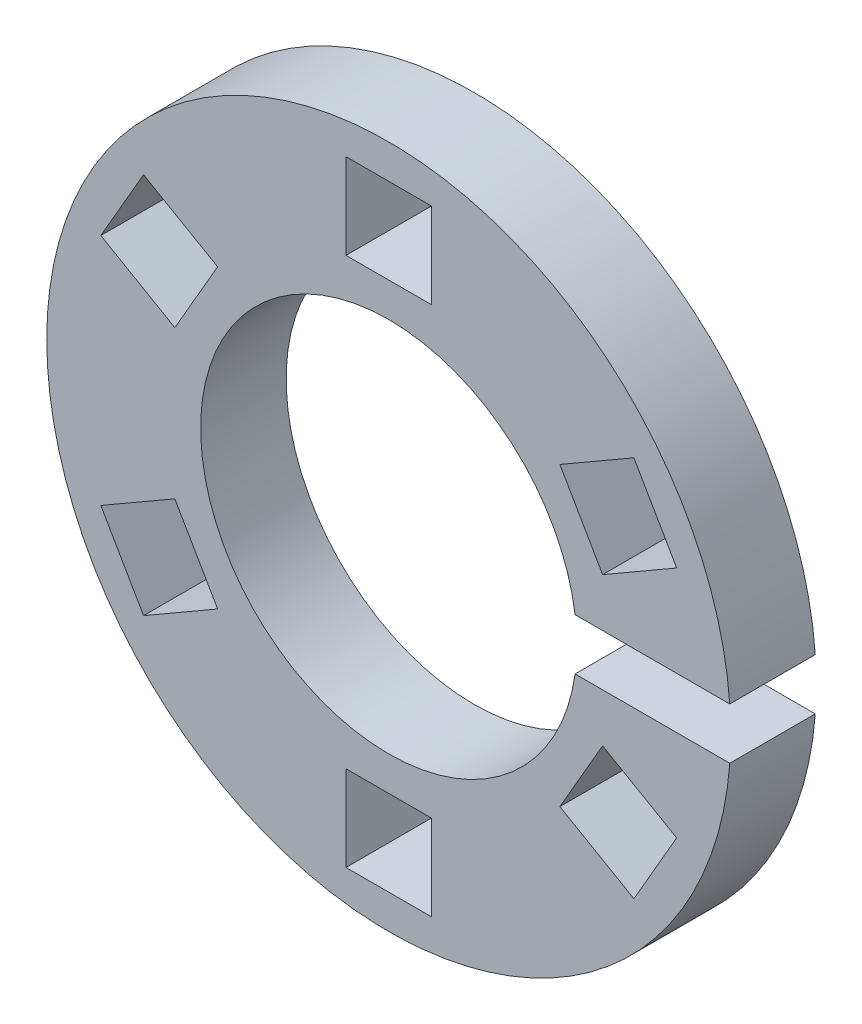
ISO-10303-21;
HEADER;
FILE_DESCRIPTION(('STEP AP214'),'2;1');
FILE_NAME('part.step','',(''),(''),'','','');
FILE_SCHEMA(('AUTOMOTIVE_DESIGN { 1 0 10303 214 1 1 1 1 }'));
ENDSEC;
DATA;
#1=APPLICATION_CONTEXT('core data for automotive mechanical design processes');
#2=APPLICATION_PROTOCOL_DEFINITION('international standard','automotive_design',2000,#1);
#3=PRODUCT_CONTEXT('',#1,'mechanical');
#4=PRODUCT('Part','Part','',(#3));
#5=PRODUCT_RELATED_PRODUCT_CATEGORY('part','',(#4));
#6=PRODUCT_DEFINITION_FORMATION('','',#4);
#7=PRODUCT_DEFINITION_CONTEXT('part definition',#1,'design');
#8=PRODUCT_DEFINITION('design','',#6,#7);
#9=PRODUCT_DEFINITION_SHAPE('','',#8);
#10=(LENGTH_UNIT() NAMED_UNIT(*) SI_UNIT(.MILLI.,.METRE.));
#11=(NAMED_UNIT(*) PLANE_ANGLE_UNIT() SI_UNIT($,.RADIAN.));
#12=(NAMED_UNIT(*) SI_UNIT($,.STERADIAN.) SOLID_ANGLE_UNIT());
#13=UNCERTAINTY_MEASURE_WITH_UNIT(LENGTH_MEASURE(1.E-05),#10,'distance_accuracy_value','');
#14=(GEOMETRIC_REPRESENTATION_CONTEXT(3) GLOBAL_UNCERTAINTY_ASSIGNED_CONTEXT((#13)) GLOBAL_UNIT_ASSIGNED_CONTEXT((#10,
#11,#12)) REPRESENTATION_CONTEXT('',''));
#15=CARTESIAN_POINT('',(0.,0.,0.));
#16=DIRECTION('',(0.,0.,1.));
#17=DIRECTION('',(1.,0.,0.));
#18=AXIS2_PLACEMENT_3D('',#15,#16,#17);
#19=CARTESIAN_POINT('',(-27.6044989172834,-2.55098574240287,21.2996199166411));
#20=DIRECTION('',(0.,0.,1.));
#21=DIRECTION('',(1.,0.,0.));
#22=AXIS2_PLACEMENT_3D('',#19,#20,#21);
#23=PLANE('',#22);
#24=DIRECTION('',(-1.,0.,0.));
#25=VECTOR('',#24,1.);
#26=CARTESIAN_POINT('',(-16.7072515584317,-1.05098574240287,21.2996199166411));
#27=LINE('',#26,#25);
#28=CARTESIAN_POINT('',(-7.66082824210429,-1.05098574240287,21.2996199166411));
#29=VERTEX_POINT('',#28);
#30=CARTESIAN_POINT('',(-16.7072515584317,-1.05098574240287,21.2996199166411));
#31=VERTEX_POINT('',#30);
#32=EDGE_CURVE('E237',#29,#31,#27,.T.);
#33=ORIENTED_EDGE('',*,*,#32,.F.);
#34=CARTESIAN_POINT('',(-27.6044989172834,-2.55098574240287,21.2996199166411));
#35=DIRECTION('',(0.,0.,1.));
#36=DIRECTION('',(1.,0.,0.));
#37=AXIS2_PLACEMENT_3D('',#34,#35,#36);
#38=CIRCLE('',#37,20.);
#39=CARTESIAN_POINT('',(-7.66082824210429,-4.05098574240287,21.2996199166411));
#40=VERTEX_POINT('',#39);
#41=EDGE_CURVE('E11',#29,#40,#38,.T.);
#42=ORIENTED_EDGE('',*,*,#41,.T.);
#43=DIRECTION('',(1.,0.,0.));
#44=VECTOR('',#43,1.);
#45=CARTESIAN_POINT('',(-16.7072515584317,-4.05098574240287,21.2996199166411));
#46=LINE('',#45,#44);
#47=CARTESIAN_POINT('',(-16.7072515584317,-4.05098574240287,21.2996199166411));
#48=VERTEX_POINT('',#47);
#49=EDGE_CURVE('E47',#48,#40,#46,.T.);
#50=ORIENTED_EDGE('',*,*,#49,.F.);
#51=CARTESIAN_POINT('',(-27.6044989172834,-2.55098574240287,21.2996199166411));
#52=DIRECTION('',(0.,0.,1.));
#53=DIRECTION('',(1.,0.,0.));
#54=AXIS2_PLACEMENT_3D('',#51,#52,#53);
#55=CIRCLE('',#54,11.);
#56=EDGE_CURVE('E224',#31,#48,#55,.T.);
#57=ORIENTED_EDGE('',*,*,#56,.F.);
#58=EDGE_LOOP('',(#33,#42,#50,#57));
#59=FACE_BOUND('',#58,.T.);
#60=DIRECTION('',(1.,0.,0.));
#61=VECTOR('',#60,1.);
#62=CARTESIAN_POINT('',(-30.1044989172834,10.4490142575971,21.2996199166411));
#63=LINE('',#62,#61);
#64=CARTESIAN_POINT('',(-30.1044989172834,10.4490142575971,21.2996199166411));
#65=VERTEX_POINT('',#64);
#66=CARTESIAN_POINT('',(-25.1044989172834,10.4490142575971,21.2996199166411));
#67=VERTEX_POINT('',#66);
#68=EDGE_CURVE('E406',#65,#67,#63,.T.);
#69=ORIENTED_EDGE('',*,*,#68,.F.);
#70=DIRECTION('',(0.,-1.,0.));
#71=VECTOR('',#70,1.);
#72=CARTESIAN_POINT('',(-30.1044989172834,15.4490142575971,21.2996199166411));
#73=LINE('',#72,#71);
#74=CARTESIAN_POINT('',(-30.1044989172834,15.4490142575971,21.2996199166411));
#75=VERTEX_POINT('',#74);
#76=EDGE_CURVE('E404',#75,#65,#73,.T.);
#77=ORIENTED_EDGE('',*,*,#76,.F.);
#78=DIRECTION('',(-1.,0.,0.));
#79=VECTOR('',#78,1.);
#80=CARTESIAN_POINT('',(-30.1044989172834,15.4490142575971,21.2996199166411));
#81=LINE('',#80,#79);
#82=CARTESIAN_POINT('',(-25.1044989172834,15.4490142575971,21.2996199166411));
#83=VERTEX_POINT('',#82);
#84=EDGE_CURVE('E412',#83,#75,#81,.T.);
#85=ORIENTED_EDGE('',*,*,#84,.F.);
#86=DIRECTION('',(0.,1.,0.));
#87=VECTOR('',#86,1.);
#88=CARTESIAN_POINT('',(-25.1044989172834,15.4490142575971,21.2996199166411));
#89=LINE('',#88,#87);
#90=EDGE_CURVE('E409',#67,#83,#89,.T.);
#91=ORIENTED_EDGE('',*,*,#90,.F.);
#92=EDGE_LOOP('',(#69,#77,#85,#91));
#93=FACE_BOUND('',#92,.T.);
#94=DIRECTION('',(-0.866025403784439,-0.5,0.));
#95=VECTOR('',#94,1.);
#96=CARTESIAN_POINT('',(-13.2660416491635,8.61407776705823,21.2996199166411));
#97=LINE('',#96,#95);
#98=CARTESIAN_POINT('',(-13.2660416491635,8.61407776705823,21.2996199166411));
#99=VERTEX_POINT('',#98);
#100=CARTESIAN_POINT('',(-17.5961686680857,6.11407776705823,21.2996199166411));
#101=VERTEX_POINT('',#100);
#102=EDGE_CURVE('E375',#99,#101,#97,.T.);
#103=ORIENTED_EDGE('',*,*,#102,.F.);
#104=DIRECTION('',(-0.5,0.866025403784438,0.));
#105=VECTOR('',#104,1.);
#106=CARTESIAN_POINT('',(-13.2660416491635,8.61407776705823,21.2996199166411));
#107=LINE('',#106,#105);
#108=CARTESIAN_POINT('',(-10.7660416491635,4.28395074813604,21.2996199166411));
#109=VERTEX_POINT('',#108);
#110=EDGE_CURVE('E373',#109,#99,#107,.T.);
#111=ORIENTED_EDGE('',*,*,#110,.F.);
#112=DIRECTION('',(0.866025403784438,0.500000000000001,0.));
#113=VECTOR('',#112,1.);
#114=CARTESIAN_POINT('',(-10.7660416491635,4.28395074813604,21.2996199166411));
#115=LINE('',#114,#113);
#116=CARTESIAN_POINT('',(-15.0961686680857,1.78395074813603,21.2996199166411));
#117=VERTEX_POINT('',#116);
#118=EDGE_CURVE('E381',#117,#109,#115,.T.);
#119=ORIENTED_EDGE('',*,*,#118,.F.);
#120=DIRECTION('',(0.5,-0.866025403784438,0.));
#121=VECTOR('',#120,1.);
#122=CARTESIAN_POINT('',(-17.5961686680857,6.11407776705823,21.2996199166411));
#123=LINE('',#122,#121);
#124=EDGE_CURVE('E378',#101,#117,#123,.T.);
#125=ORIENTED_EDGE('',*,*,#124,.F.);
#126=EDGE_LOOP('',(#103,#111,#119,#125));
#127=FACE_BOUND('',#126,.T.);
#128=DIRECTION('',(-0.866025403784439,0.5,0.));
#129=VECTOR('',#128,1.);
#130=CARTESIAN_POINT('',(-10.7660416491635,-9.38592223294176,21.2996199166411));
#131=LINE('',#130,#129);
#132=CARTESIAN_POINT('',(-10.7660416491635,-9.38592223294176,21.2996199166411));
#133=VERTEX_POINT('',#132);
#134=CARTESIAN_POINT('',(-15.0961686680857,-6.88592223294177,21.2996199166411));
#135=VERTEX_POINT('',#134);
#136=EDGE_CURVE('E344',#133,#135,#131,.T.);
#137=ORIENTED_EDGE('',*,*,#136,.F.);
#138=DIRECTION('',(0.5,0.866025403784439,0.));
#139=VECTOR('',#138,1.);
#140=CARTESIAN_POINT('',(-10.7660416491635,-9.38592223294176,21.2996199166411));
#141=LINE('',#140,#139);
#142=CARTESIAN_POINT('',(-13.2660416491635,-13.716049251864,21.2996199166411));
#143=VERTEX_POINT('',#142);
#144=EDGE_CURVE('E342',#143,#133,#141,.T.);
#145=ORIENTED_EDGE('',*,*,#144,.F.);
#146=DIRECTION('',(0.866025403784439,-0.499999999999999,0.));
#147=VECTOR('',#146,1.);
#148=CARTESIAN_POINT('',(-13.2660416491635,-13.716049251864,21.2996199166411));
#149=LINE('',#148,#147);
#150=CARTESIAN_POINT('',(-17.5961686680857,-11.216049251864,21.2996199166411));
#151=VERTEX_POINT('',#150);
#152=EDGE_CURVE('E350',#151,#143,#149,.T.);
#153=ORIENTED_EDGE('',*,*,#152,.F.);
#154=DIRECTION('',(-0.5,-0.866025403784439,0.));
#155=VECTOR('',#154,1.);
#156=CARTESIAN_POINT('',(-15.0961686680857,-6.88592223294177,21.2996199166411));
#157=LINE('',#156,#155);
#158=EDGE_CURVE('E347',#135,#151,#157,.T.);
#159=ORIENTED_EDGE('',*,*,#158,.F.);
#160=EDGE_LOOP('',(#137,#145,#153,#159));
#161=FACE_BOUND('',#160,.T.);
#162=DIRECTION('',(0.,1.,0.));
#163=VECTOR('',#162,1.);
#164=CARTESIAN_POINT('',(-25.1044989172834,-20.5509857424029,21.2996199166411));
#165=LINE('',#164,#163);
#166=CARTESIAN_POINT('',(-25.1044989172834,-20.5509857424029,21.2996199166411));
#167=VERTEX_POINT('',#166);
#168=CARTESIAN_POINT('',(-25.1044989172834,-15.5509857424029,21.2996199166411));
#169=VERTEX_POINT('',#168);
#170=EDGE_CURVE('E313',#167,#169,#165,.T.);
#171=ORIENTED_EDGE('',*,*,#170,.F.);
#172=DIRECTION('',(1.,0.,0.));
#173=VECTOR('',#172,1.);
#174=CARTESIAN_POINT('',(-25.1044989172834,-20.5509857424029,21.2996199166411));
#175=LINE('',#174,#173);
#176=CARTESIAN_POINT('',(-30.1044989172834,-20.5509857424029,21.2996199166411));
#177=VERTEX_POINT('',#176);
#178=EDGE_CURVE('E311',#177,#167,#175,.T.);
#179=ORIENTED_EDGE('',*,*,#178,.F.);
#180=DIRECTION('',(0.,-1.,0.));
#181=VECTOR('',#180,1.);
#182=CARTESIAN_POINT('',(-30.1044989172834,-20.5509857424029,21.2996199166411));
#183=LINE('',#182,#181);
#184=CARTESIAN_POINT('',(-30.1044989172834,-15.5509857424029,21.2996199166411));
#185=VERTEX_POINT('',#184);
#186=EDGE_CURVE('E319',#185,#177,#183,.T.);
#187=ORIENTED_EDGE('',*,*,#186,.F.);
#188=DIRECTION('',(-1.,0.,0.));
#189=VECTOR('',#188,1.);
#190=CARTESIAN_POINT('',(-25.1044989172834,-15.5509857424029,21.2996199166411));
#191=LINE('',#190,#189);
#192=EDGE_CURVE('E316',#169,#185,#191,.T.);
#193=ORIENTED_EDGE('',*,*,#192,.F.);
#194=EDGE_LOOP('',(#171,#179,#187,#193));
#195=FACE_BOUND('',#194,.T.);
#196=DIRECTION('',(0.866025403784438,0.5,0.));
#197=VECTOR('',#196,1.);
#198=CARTESIAN_POINT('',(-41.9429561854033,-13.716049251864,21.2996199166411));
#199=LINE('',#198,#197);
#200=CARTESIAN_POINT('',(-41.9429561854033,-13.716049251864,21.2996199166411));
#201=VERTEX_POINT('',#200);
#202=CARTESIAN_POINT('',(-37.6128291664811,-11.216049251864,21.2996199166411));
#203=VERTEX_POINT('',#202);
#204=EDGE_CURVE('E282',#201,#203,#199,.T.);
#205=ORIENTED_EDGE('',*,*,#204,.F.);
#206=DIRECTION('',(0.5,-0.866025403784438,0.));
#207=VECTOR('',#206,1.);
#208=CARTESIAN_POINT('',(-41.9429561854033,-13.716049251864,21.2996199166411));
#209=LINE('',#208,#207);
#210=CARTESIAN_POINT('',(-44.4429561854033,-9.38592223294178,21.2996199166411));
#211=VERTEX_POINT('',#210);
#212=EDGE_CURVE('E280',#211,#201,#209,.T.);
#213=ORIENTED_EDGE('',*,*,#212,.F.);
#214=DIRECTION('',(-0.866025403784438,-0.500000000000001,0.));
#215=VECTOR('',#214,1.);
#216=CARTESIAN_POINT('',(-44.4429561854033,-9.38592223294178,21.2996199166411));
#217=LINE('',#216,#215);
#218=CARTESIAN_POINT('',(-40.1128291664811,-6.88592223294177,21.2996199166411));
#219=VERTEX_POINT('',#218);
#220=EDGE_CURVE('E288',#219,#211,#217,.T.);
#221=ORIENTED_EDGE('',*,*,#220,.F.);
#222=DIRECTION('',(-0.5,0.866025403784438,0.));
#223=VECTOR('',#222,1.);
#224=CARTESIAN_POINT('',(-37.6128291664811,-11.216049251864,21.2996199166411));
#225=LINE('',#224,#223);
#226=EDGE_CURVE('E285',#203,#219,#225,.T.);
#227=ORIENTED_EDGE('',*,*,#226,.F.);
#228=EDGE_LOOP('',(#205,#213,#221,#227));
#229=FACE_BOUND('',#228,.T.);
#230=DIRECTION('',(0.866025403784439,-0.499999999999999,0.));
#231=VECTOR('',#230,1.);
#232=CARTESIAN_POINT('',(-44.4429561854033,4.28395074813602,21.2996199166411));
#233=LINE('',#232,#231);
#234=CARTESIAN_POINT('',(-44.4429561854033,4.28395074813602,21.2996199166411));
#235=VERTEX_POINT('',#234);
#236=CARTESIAN_POINT('',(-40.1128291664811,1.78395074813602,21.2996199166411));
#237=VERTEX_POINT('',#236);
#238=EDGE_CURVE('E253',#235,#237,#233,.T.);
#239=ORIENTED_EDGE('',*,*,#238,.F.);
#240=DIRECTION('',(-0.499999999999999,-0.866025403784439,0.));
#241=VECTOR('',#240,1.);
#242=CARTESIAN_POINT('',(-44.4429561854033,4.28395074813602,21.2996199166411));
#243=LINE('',#242,#241);
#244=CARTESIAN_POINT('',(-41.9429561854033,8.61407776705822,21.2996199166411));
#245=VERTEX_POINT('',#244);
#246=EDGE_CURVE('E251',#245,#235,#243,.T.);
#247=ORIENTED_EDGE('',*,*,#246,.F.);
#248=DIRECTION('',(-0.86602540378444,0.499999999999999,0.));
#249=VECTOR('',#248,1.);
#250=CARTESIAN_POINT('',(-41.9429561854033,8.61407776705822,21.2996199166411));
#251=LINE('',#250,#249);
#252=CARTESIAN_POINT('',(-37.6128291664811,6.11407776705822,21.2996199166411));
#253=VERTEX_POINT('',#252);
#254=EDGE_CURVE('E258',#253,#245,#251,.T.);
#255=ORIENTED_EDGE('',*,*,#254,.F.);
#256=DIRECTION('',(0.499999999999999,0.866025403784439,0.));
#257=VECTOR('',#256,1.);
#258=CARTESIAN_POINT('',(-40.1128291664811,1.78395074813602,21.2996199166411));
#259=LINE('',#258,#257);
#260=EDGE_CURVE('E256',#237,#253,#259,.T.);
#261=ORIENTED_EDGE('',*,*,#260,.F.);
#262=EDGE_LOOP('',(#239,#247,#255,#261));
#263=FACE_BOUND('',#262,.T.);
#264=ADVANCED_FACE('F32',(#59,#93,#127,#161,#195,#229,#263),#23,.T.);
#265=CARTESIAN_POINT('',(-27.6044989172834,-2.55098574240287,16.2996199166411));
#266=DIRECTION('',(0.,0.,1.));
#267=DIRECTION('',(1.,0.,0.));
#268=AXIS2_PLACEMENT_3D('',#265,#266,#267);
#269=PLANE('',#268);
#270=DIRECTION('',(0.5,-0.866025403784438,0.));
#271=VECTOR('',#270,1.);
#272=CARTESIAN_POINT('',(-41.9429561854033,-13.716049251864,16.2996199166411));
#273=LINE('',#272,#271);
#274=CARTESIAN_POINT('',(-44.4429561854033,-9.38592223294178,16.2996199166411));
#275=VERTEX_POINT('',#274);
#276=CARTESIAN_POINT('',(-41.9429561854033,-13.716049251864,16.2996199166411));
#277=VERTEX_POINT('',#276);
#278=EDGE_CURVE('E279',#275,#277,#273,.T.);
#279=ORIENTED_EDGE('',*,*,#278,.T.);
#280=DIRECTION('',(0.866025403784438,0.5,0.));
#281=VECTOR('',#280,1.);
#282=CARTESIAN_POINT('',(-41.9429561854033,-13.716049251864,16.2996199166411));
#283=LINE('',#282,#281);
#284=CARTESIAN_POINT('',(-37.6128291664811,-11.216049251864,16.2996199166411));
#285=VERTEX_POINT('',#284);
#286=EDGE_CURVE('E293',#277,#285,#283,.T.);
#287=ORIENTED_EDGE('',*,*,#286,.T.);
#288=DIRECTION('',(-0.5,0.866025403784438,0.));
#289=VECTOR('',#288,1.);
#290=CARTESIAN_POINT('',(-37.6128291664811,-11.216049251864,16.2996199166411));
#291=LINE('',#290,#289);
#292=CARTESIAN_POINT('',(-40.1128291664811,-6.88592223294177,16.2996199166411));
#293=VERTEX_POINT('',#292);
#294=EDGE_CURVE('E296',#285,#293,#291,.T.);
#295=ORIENTED_EDGE('',*,*,#294,.T.);
#296=DIRECTION('',(-0.866025403784438,-0.500000000000001,0.));
#297=VECTOR('',#296,1.);
#298=CARTESIAN_POINT('',(-44.4429561854033,-9.38592223294178,16.2996199166411));
#299=LINE('',#298,#297);
#300=EDGE_CURVE('E283',#293,#275,#299,.T.);
#301=ORIENTED_EDGE('',*,*,#300,.T.);
#302=EDGE_LOOP('',(#279,#287,#295,#301));
#303=FACE_BOUND('',#302,.T.);
#304=DIRECTION('',(0.5,0.866025403784439,0.));
#305=VECTOR('',#304,1.);
#306=CARTESIAN_POINT('',(-10.7660416491635,-9.38592223294176,16.2996199166411));
#307=LINE('',#306,#305);
#308=CARTESIAN_POINT('',(-13.2660416491635,-13.716049251864,16.2996199166411));
#309=VERTEX_POINT('',#308);
#310=CARTESIAN_POINT('',(-10.7660416491635,-9.38592223294176,16.2996199166411));
#311=VERTEX_POINT('',#310);
#312=EDGE_CURVE('E341',#309,#311,#307,.T.);
#313=ORIENTED_EDGE('',*,*,#312,.T.);
#314=DIRECTION('',(-0.866025403784439,0.5,0.));
#315=VECTOR('',#314,1.);
#316=CARTESIAN_POINT('',(-10.7660416491635,-9.38592223294176,16.2996199166411));
#317=LINE('',#316,#315);
#318=CARTESIAN_POINT('',(-15.0961686680857,-6.88592223294177,16.2996199166411));
#319=VERTEX_POINT('',#318);
#320=EDGE_CURVE('E355',#311,#319,#317,.T.);
#321=ORIENTED_EDGE('',*,*,#320,.T.);
#322=DIRECTION('',(-0.5,-0.866025403784439,0.));
#323=VECTOR('',#322,1.);
#324=CARTESIAN_POINT('',(-15.0961686680857,-6.88592223294177,16.2996199166411));
#325=LINE('',#324,#323);
#326=CARTESIAN_POINT('',(-17.5961686680857,-11.216049251864,16.2996199166411));
#327=VERTEX_POINT('',#326);
#328=EDGE_CURVE('E358',#319,#327,#325,.T.);
#329=ORIENTED_EDGE('',*,*,#328,.T.);
#330=DIRECTION('',(0.866025403784439,-0.499999999999999,0.));
#331=VECTOR('',#330,1.);
#332=CARTESIAN_POINT('',(-13.2660416491635,-13.716049251864,16.2996199166411));
#333=LINE('',#332,#331);
#334=EDGE_CURVE('E345',#327,#309,#333,.T.);
#335=ORIENTED_EDGE('',*,*,#334,.T.);
#336=EDGE_LOOP('',(#313,#321,#329,#335));
#337=FACE_BOUND('',#336,.T.);
#338=DIRECTION('',(0.,-1.,0.));
#339=VECTOR('',#338,1.);
#340=CARTESIAN_POINT('',(-30.1044989172834,15.4490142575971,16.2996199166411));
#341=LINE('',#340,#339);
#342=CARTESIAN_POINT('',(-30.1044989172834,15.4490142575971,16.2996199166411));
#343=VERTEX_POINT('',#342);
#344=CARTESIAN_POINT('',(-30.1044989172834,10.4490142575971,16.2996199166411));
#345=VERTEX_POINT('',#344);
#346=EDGE_CURVE('E403',#343,#345,#341,.T.);
#347=ORIENTED_EDGE('',*,*,#346,.T.);
#348=DIRECTION('',(1.,0.,0.));
#349=VECTOR('',#348,1.);
#350=CARTESIAN_POINT('',(-30.1044989172834,10.4490142575971,16.2996199166411));
#351=LINE('',#350,#349);
#352=CARTESIAN_POINT('',(-25.1044989172834,10.4490142575971,16.2996199166411));
#353=VERTEX_POINT('',#352);
#354=EDGE_CURVE('E417',#345,#353,#351,.T.);
#355=ORIENTED_EDGE('',*,*,#354,.T.);
#356=DIRECTION('',(0.,1.,0.));
#357=VECTOR('',#356,1.);
#358=CARTESIAN_POINT('',(-25.1044989172834,15.4490142575971,16.2996199166411));
#359=LINE('',#358,#357);
#360=CARTESIAN_POINT('',(-25.1044989172834,15.4490142575971,16.2996199166411));
#361=VERTEX_POINT('',#360);
#362=EDGE_CURVE('E420',#353,#361,#359,.T.);
#363=ORIENTED_EDGE('',*,*,#362,.T.);
#364=DIRECTION('',(-1.,0.,0.));
#365=VECTOR('',#364,1.);
#366=CARTESIAN_POINT('',(-30.1044989172834,15.4490142575971,16.2996199166411));
#367=LINE('',#366,#365);
#368=EDGE_CURVE('E407',#361,#343,#367,.T.);
#369=ORIENTED_EDGE('',*,*,#368,.T.);
#370=EDGE_LOOP('',(#347,#355,#363,#369));
#371=FACE_BOUND('',#370,.T.);
#372=CARTESIAN_POINT('',(-27.6044989172834,-2.55098574240287,16.2996199166411));
#373=DIRECTION('',(0.,0.,1.));
#374=DIRECTION('',(1.,0.,0.));
#375=AXIS2_PLACEMENT_3D('',#372,#373,#374);
#376=CIRCLE('',#375,20.);
#377=CARTESIAN_POINT('',(-7.66082824210429,-1.05098574240287,16.2996199166411));
#378=VERTEX_POINT('',#377);
#379=CARTESIAN_POINT('',(-7.66082824210429,-4.05098574240286,16.2996199166411));
#380=VERTEX_POINT('',#379);
#381=EDGE_CURVE('E36',#378,#380,#376,.T.);
#382=ORIENTED_EDGE('',*,*,#381,.F.);
#383=DIRECTION('',(-1.,0.,0.));
#384=VECTOR('',#383,1.);
#385=CARTESIAN_POINT('',(-16.7072515584317,-1.05098574240287,16.2996199166411));
#386=LINE('',#385,#384);
#387=CARTESIAN_POINT('',(-16.7072515584317,-1.05098574240287,16.2996199166411));
#388=VERTEX_POINT('',#387);
#389=EDGE_CURVE('E226',#378,#388,#386,.T.);
#390=ORIENTED_EDGE('',*,*,#389,.T.);
#391=CARTESIAN_POINT('',(-27.6044989172834,-2.55098574240287,16.2996199166411));
#392=DIRECTION('',(0.,0.,1.));
#393=DIRECTION('',(1.,0.,0.));
#394=AXIS2_PLACEMENT_3D('',#391,#392,#393);
#395=CIRCLE('',#394,11.);
#396=CARTESIAN_POINT('',(-16.7072515584317,-4.05098574240287,16.2996199166411));
#397=VERTEX_POINT('',#396);
#398=EDGE_CURVE('E221',#388,#397,#395,.T.);
#399=ORIENTED_EDGE('',*,*,#398,.T.);
#400=DIRECTION('',(1.,0.,0.));
#401=VECTOR('',#400,1.);
#402=CARTESIAN_POINT('',(-16.7072515584317,-4.05098574240287,16.2996199166411));
#403=LINE('',#402,#401);
#404=EDGE_CURVE('E229',#397,#380,#403,.T.);
#405=ORIENTED_EDGE('',*,*,#404,.T.);
#406=EDGE_LOOP('',(#382,#390,#399,#405));
#407=FACE_BOUND('',#406,.T.);
#408=DIRECTION('',(-0.5,0.866025403784438,0.));
#409=VECTOR('',#408,1.);
#410=CARTESIAN_POINT('',(-13.2660416491635,8.61407776705823,16.2996199166411));
#411=LINE('',#410,#409);
#412=CARTESIAN_POINT('',(-10.7660416491635,4.28395074813604,16.2996199166411));
#413=VERTEX_POINT('',#412);
#414=CARTESIAN_POINT('',(-13.2660416491635,8.61407776705823,16.2996199166411));
#415=VERTEX_POINT('',#414);
#416=EDGE_CURVE('E372',#413,#415,#411,.T.);
#417=ORIENTED_EDGE('',*,*,#416,.T.);
#418=DIRECTION('',(-0.866025403784439,-0.5,0.));
#419=VECTOR('',#418,1.);
#420=CARTESIAN_POINT('',(-13.2660416491635,8.61407776705823,16.2996199166411));
#421=LINE('',#420,#419);
#422=CARTESIAN_POINT('',(-17.5961686680857,6.11407776705823,16.2996199166411));
#423=VERTEX_POINT('',#422);
#424=EDGE_CURVE('E386',#415,#423,#421,.T.);
#425=ORIENTED_EDGE('',*,*,#424,.T.);
#426=DIRECTION('',(0.5,-0.866025403784438,0.));
#427=VECTOR('',#426,1.);
#428=CARTESIAN_POINT('',(-17.5961686680857,6.11407776705823,16.2996199166411));
#429=LINE('',#428,#427);
#430=CARTESIAN_POINT('',(-15.0961686680857,1.78395074813603,16.2996199166411));
#431=VERTEX_POINT('',#430);
#432=EDGE_CURVE('E389',#423,#431,#429,.T.);
#433=ORIENTED_EDGE('',*,*,#432,.T.);
#434=DIRECTION('',(0.866025403784438,0.500000000000001,0.));
#435=VECTOR('',#434,1.);
#436=CARTESIAN_POINT('',(-10.7660416491635,4.28395074813604,16.2996199166411));
#437=LINE('',#436,#435);
#438=EDGE_CURVE('E376',#431,#413,#437,.T.);
#439=ORIENTED_EDGE('',*,*,#438,.T.);
#440=EDGE_LOOP('',(#417,#425,#433,#439));
#441=FACE_BOUND('',#440,.T.);
#442=DIRECTION('',(1.,0.,0.));
#443=VECTOR('',#442,1.);
#444=CARTESIAN_POINT('',(-25.1044989172834,-20.5509857424029,16.2996199166411));
#445=LINE('',#444,#443);
#446=CARTESIAN_POINT('',(-30.1044989172834,-20.5509857424029,16.2996199166411));
#447=VERTEX_POINT('',#446);
#448=CARTESIAN_POINT('',(-25.1044989172834,-20.5509857424029,16.2996199166411));
#449=VERTEX_POINT('',#448);
#450=EDGE_CURVE('E310',#447,#449,#445,.T.);
#451=ORIENTED_EDGE('',*,*,#450,.T.);
#452=DIRECTION('',(0.,1.,0.));
#453=VECTOR('',#452,1.);
#454=CARTESIAN_POINT('',(-25.1044989172834,-20.5509857424029,16.2996199166411));
#455=LINE('',#454,#453);
#456=CARTESIAN_POINT('',(-25.1044989172834,-15.5509857424029,16.2996199166411));
#457=VERTEX_POINT('',#456);
#458=EDGE_CURVE('E324',#449,#457,#455,.T.);
#459=ORIENTED_EDGE('',*,*,#458,.T.);
#460=DIRECTION('',(-1.,0.,0.));
#461=VECTOR('',#460,1.);
#462=CARTESIAN_POINT('',(-25.1044989172834,-15.5509857424029,16.2996199166411));
#463=LINE('',#462,#461);
#464=CARTESIAN_POINT('',(-30.1044989172834,-15.5509857424029,16.2996199166411));
#465=VERTEX_POINT('',#464);
#466=EDGE_CURVE('E327',#457,#465,#463,.T.);
#467=ORIENTED_EDGE('',*,*,#466,.T.);
#468=DIRECTION('',(0.,-1.,0.));
#469=VECTOR('',#468,1.);
#470=CARTESIAN_POINT('',(-30.1044989172834,-20.5509857424029,16.2996199166411));
#471=LINE('',#470,#469);
#472=EDGE_CURVE('E314',#465,#447,#471,.T.);
#473=ORIENTED_EDGE('',*,*,#472,.T.);
#474=EDGE_LOOP('',(#451,#459,#467,#473));
#475=FACE_BOUND('',#474,.T.);
#476=DIRECTION('',(-0.499999999999999,-0.866025403784439,0.));
#477=VECTOR('',#476,1.);
#478=CARTESIAN_POINT('',(-44.4429561854033,4.28395074813602,16.2996199166411));
#479=LINE('',#478,#477);
#480=CARTESIAN_POINT('',(-41.9429561854033,8.61407776705822,16.2996199166411));
#481=VERTEX_POINT('',#480);
#482=CARTESIAN_POINT('',(-44.4429561854033,4.28395074813602,16.2996199166411));
#483=VERTEX_POINT('',#482);
#484=EDGE_CURVE('E247',#481,#483,#479,.T.);
#485=ORIENTED_EDGE('',*,*,#484,.T.);
#486=DIRECTION('',(0.866025403784439,-0.499999999999999,0.));
#487=VECTOR('',#486,1.);
#488=CARTESIAN_POINT('',(-44.4429561854033,4.28395074813602,16.2996199166411));
#489=LINE('',#488,#487);
#490=CARTESIAN_POINT('',(-40.1128291664811,1.78395074813602,16.2996199166411));
#491=VERTEX_POINT('',#490);
#492=EDGE_CURVE('E263',#483,#491,#489,.T.);
#493=ORIENTED_EDGE('',*,*,#492,.T.);
#494=DIRECTION('',(0.499999999999999,0.866025403784439,0.));
#495=VECTOR('',#494,1.);
#496=CARTESIAN_POINT('',(-40.1128291664811,1.78395074813602,16.2996199166411));
#497=LINE('',#496,#495);
#498=CARTESIAN_POINT('',(-37.6128291664811,6.11407776705822,16.2996199166411));
#499=VERTEX_POINT('',#498);
#500=EDGE_CURVE('E266',#491,#499,#497,.T.);
#501=ORIENTED_EDGE('',*,*,#500,.T.);
#502=DIRECTION('',(-0.86602540378444,0.499999999999999,0.));
#503=VECTOR('',#502,1.);
#504=CARTESIAN_POINT('',(-41.9429561854033,8.61407776705822,16.2996199166411));
#505=LINE('',#504,#503);
#506=EDGE_CURVE('E254',#499,#481,#505,.T.);
#507=ORIENTED_EDGE('',*,*,#506,.T.);
#508=EDGE_LOOP('',(#485,#493,#501,#507));
#509=FACE_BOUND('',#508,.T.);
#510=ADVANCED_FACE('F235',(#303,#337,#371,#407,#441,#475,#509),#269,.F.);
#511=CARTESIAN_POINT('',(-27.6044989172834,-2.55098574240287,21.2996199166411));
#512=DIRECTION('',(0.,0.,-1.));
#513=DIRECTION('',(-1.,0.,0.));
#514=AXIS2_PLACEMENT_3D('',#511,#512,#513);
#515=CYLINDRICAL_SURFACE('',#514,20.);
#516=ORIENTED_EDGE('',*,*,#41,.F.);
#517=DIRECTION('',(0.,0.,1.));
#518=VECTOR('',#517,1.);
#519=CARTESIAN_POINT('',(-7.66082824210429,-1.05098574240287,16.2996199166411));
#520=LINE('',#519,#518);
#521=EDGE_CURVE('E248',#378,#29,#520,.T.);
#522=ORIENTED_EDGE('',*,*,#521,.F.);
#523=ORIENTED_EDGE('',*,*,#381,.T.);
#524=DIRECTION('',(0.,0.,1.));
#525=VECTOR('',#524,1.);
#526=CARTESIAN_POINT('',(-7.66082824210429,-4.05098574240286,16.2996199166411));
#527=LINE('',#526,#525);
#528=EDGE_CURVE('E225',#380,#40,#527,.T.);
#529=ORIENTED_EDGE('',*,*,#528,.T.);
#530=EDGE_LOOP('',(#516,#522,#523,#529));
#531=FACE_BOUND('',#530,.T.);
#532=ADVANCED_FACE('F34',(#531),#515,.T.);
#533=CARTESIAN_POINT('',(-30.1044989172834,15.4490142575971,21.2996199166411));
#534=DIRECTION('',(1.,0.,0.));
#535=DIRECTION('',(0.,1.,0.));
#536=AXIS2_PLACEMENT_3D('',#533,#534,#535);
#537=PLANE('',#536);
#538=ORIENTED_EDGE('',*,*,#346,.F.);
#539=DIRECTION('',(0.,0.,-1.));
#540=VECTOR('',#539,1.);
#541=CARTESIAN_POINT('',(-30.1044989172834,15.4490142575971,21.2996199166411));
#542=LINE('',#541,#540);
#543=EDGE_CURVE('E414',#75,#343,#542,.T.);
#544=ORIENTED_EDGE('',*,*,#543,.F.);
#545=ORIENTED_EDGE('',*,*,#76,.T.);
#546=DIRECTION('',(0.,0.,-1.));
#547=VECTOR('',#546,1.);
#548=CARTESIAN_POINT('',(-30.1044989172834,10.4490142575971,21.2996199166411));
#549=LINE('',#548,#547);
#550=EDGE_CURVE('E431',#65,#345,#549,.T.);
#551=ORIENTED_EDGE('',*,*,#550,.T.);
#552=EDGE_LOOP('',(#538,#544,#545,#551));
#553=FACE_BOUND('',#552,.T.);
#554=ADVANCED_FACE('F570',(#553),#537,.T.);
#555=CARTESIAN_POINT('',(-30.1044989172834,10.4490142575971,21.2996199166411));
#556=DIRECTION('',(0.,1.,0.));
#557=DIRECTION('',(0.,0.,1.));
#558=AXIS2_PLACEMENT_3D('',#555,#556,#557);
#559=PLANE('',#558);
#560=ORIENTED_EDGE('',*,*,#354,.F.);
#561=ORIENTED_EDGE('',*,*,#550,.F.);
#562=ORIENTED_EDGE('',*,*,#68,.T.);
#563=DIRECTION('',(0.,0.,-1.));
#564=VECTOR('',#563,1.);
#565=CARTESIAN_POINT('',(-25.1044989172834,10.4490142575971,21.2996199166411));
#566=LINE('',#565,#564);
#567=EDGE_CURVE('E429',#67,#353,#566,.T.);
#568=ORIENTED_EDGE('',*,*,#567,.T.);
#569=EDGE_LOOP('',(#560,#561,#562,#568));
#570=FACE_BOUND('',#569,.T.);
#571=ADVANCED_FACE('F566',(#570),#559,.T.);
#572=CARTESIAN_POINT('',(-25.1044989172834,15.4490142575971,21.2996199166411));
#573=DIRECTION('',(-1.,0.,0.));
#574=DIRECTION('',(0.,-1.,0.));
#575=AXIS2_PLACEMENT_3D('',#572,#573,#574);
#576=PLANE('',#575);
#577=ORIENTED_EDGE('',*,*,#362,.F.);
#578=ORIENTED_EDGE('',*,*,#567,.F.);
#579=ORIENTED_EDGE('',*,*,#90,.T.);
#580=DIRECTION('',(0.,0.,-1.));
#581=VECTOR('',#580,1.);
#582=CARTESIAN_POINT('',(-25.1044989172834,15.4490142575971,21.2996199166411));
#583=LINE('',#582,#581);
#584=EDGE_CURVE('E427',#83,#361,#583,.T.);
#585=ORIENTED_EDGE('',*,*,#584,.T.);
#586=EDGE_LOOP('',(#577,#578,#579,#585));
#587=FACE_BOUND('',#586,.T.);
#588=ADVANCED_FACE('F562',(#587),#576,.T.);
#589=CARTESIAN_POINT('',(-30.1044989172834,15.4490142575971,21.2996199166411));
#590=DIRECTION('',(0.,-1.,0.));
#591=DIRECTION('',(0.,0.,-1.));
#592=AXIS2_PLACEMENT_3D('',#589,#590,#591);
#593=PLANE('',#592);
#594=ORIENTED_EDGE('',*,*,#368,.F.);
#595=ORIENTED_EDGE('',*,*,#584,.F.);
#596=ORIENTED_EDGE('',*,*,#84,.T.);
#597=ORIENTED_EDGE('',*,*,#543,.T.);
#598=EDGE_LOOP('',(#594,#595,#596,#597));
#599=FACE_BOUND('',#598,.T.);
#600=ADVANCED_FACE('F558',(#599),#593,.T.);
#601=CARTESIAN_POINT('',(-13.2660416491635,8.61407776705823,21.2996199166411));
#602=DIRECTION('',(-0.866025403784438,-0.5,0.));
#603=DIRECTION('',(0.5,-0.866025403784438,0.));
#604=AXIS2_PLACEMENT_3D('',#601,#602,#603);
#605=PLANE('',#604);
#606=ORIENTED_EDGE('',*,*,#416,.F.);
#607=DIRECTION('',(0.,0.,-1.));
#608=VECTOR('',#607,1.);
#609=CARTESIAN_POINT('',(-10.7660416491635,4.28395074813604,21.2996199166411));
#610=LINE('',#609,#608);
#611=EDGE_CURVE('E383',#109,#413,#610,.T.);
#612=ORIENTED_EDGE('',*,*,#611,.F.);
#613=ORIENTED_EDGE('',*,*,#110,.T.);
#614=DIRECTION('',(0.,0.,-1.));
#615=VECTOR('',#614,1.);
#616=CARTESIAN_POINT('',(-13.2660416491635,8.61407776705823,21.2996199166411));
#617=LINE('',#616,#615);
#618=EDGE_CURVE('E400',#99,#415,#617,.T.);
#619=ORIENTED_EDGE('',*,*,#618,.T.);
#620=EDGE_LOOP('',(#606,#612,#613,#619));
#621=FACE_BOUND('',#620,.T.);
#622=ADVANCED_FACE('F554',(#621),#605,.T.);
#623=CARTESIAN_POINT('',(-13.2660416491635,8.61407776705823,21.2996199166411));
#624=DIRECTION('',(0.5,-0.866025403784439,0.));
#625=DIRECTION('',(0.866025403784439,0.5,0.));
#626=AXIS2_PLACEMENT_3D('',#623,#624,#625);
#627=PLANE('',#626);
#628=ORIENTED_EDGE('',*,*,#424,.F.);
#629=ORIENTED_EDGE('',*,*,#618,.F.);
#630=ORIENTED_EDGE('',*,*,#102,.T.);
#631=DIRECTION('',(0.,0.,-1.));
#632=VECTOR('',#631,1.);
#633=CARTESIAN_POINT('',(-17.5961686680857,6.11407776705823,21.2996199166411));
#634=LINE('',#633,#632);
#635=EDGE_CURVE('E398',#101,#423,#634,.T.);
#636=ORIENTED_EDGE('',*,*,#635,.T.);
#637=EDGE_LOOP('',(#628,#629,#630,#636));
#638=FACE_BOUND('',#637,.T.);
#639=ADVANCED_FACE('F550',(#638),#627,.T.);
#640=CARTESIAN_POINT('',(-17.5961686680857,6.11407776705823,21.2996199166411));
#641=DIRECTION('',(0.866025403784439,0.5,0.));
#642=DIRECTION('',(-0.5,0.866025403784439,0.));
#643=AXIS2_PLACEMENT_3D('',#640,#641,#642);
#644=PLANE('',#643);
#645=ORIENTED_EDGE('',*,*,#432,.F.);
#646=ORIENTED_EDGE('',*,*,#635,.F.);
#647=ORIENTED_EDGE('',*,*,#124,.T.);
#648=DIRECTION('',(0.,0.,-1.));
#649=VECTOR('',#648,1.);
#650=CARTESIAN_POINT('',(-15.0961686680857,1.78395074813603,21.2996199166411));
#651=LINE('',#650,#649);
#652=EDGE_CURVE('E396',#117,#431,#651,.T.);
#653=ORIENTED_EDGE('',*,*,#652,.T.);
#654=EDGE_LOOP('',(#645,#646,#647,#653));
#655=FACE_BOUND('',#654,.T.);
#656=ADVANCED_FACE('F546',(#655),#644,.T.);
#657=CARTESIAN_POINT('',(-10.7660416491635,4.28395074813604,21.2996199166411));
#658=DIRECTION('',(-0.500000000000001,0.866025403784438,0.));
#659=DIRECTION('',(-0.866025403784438,-0.500000000000001,0.));
#660=AXIS2_PLACEMENT_3D('',#657,#658,#659);
#661=PLANE('',#660);
#662=ORIENTED_EDGE('',*,*,#438,.F.);
#663=ORIENTED_EDGE('',*,*,#652,.F.);
#664=ORIENTED_EDGE('',*,*,#118,.T.);
#665=ORIENTED_EDGE('',*,*,#611,.T.);
#666=EDGE_LOOP('',(#662,#663,#664,#665));
#667=FACE_BOUND('',#666,.T.);
#668=ADVANCED_FACE('F542',(#667),#661,.T.);
#669=CARTESIAN_POINT('',(-10.7660416491635,-9.38592223294176,21.2996199166411));
#670=DIRECTION('',(-0.866025403784439,0.5,0.));
#671=DIRECTION('',(-0.5,-0.866025403784439,0.));
#672=AXIS2_PLACEMENT_3D('',#669,#670,#671);
#673=PLANE('',#672);
#674=ORIENTED_EDGE('',*,*,#312,.F.);
#675=DIRECTION('',(0.,0.,-1.));
#676=VECTOR('',#675,1.);
#677=CARTESIAN_POINT('',(-13.2660416491635,-13.716049251864,21.2996199166411));
#678=LINE('',#677,#676);
#679=EDGE_CURVE('E352',#143,#309,#678,.T.);
#680=ORIENTED_EDGE('',*,*,#679,.F.);
#681=ORIENTED_EDGE('',*,*,#144,.T.);
#682=DIRECTION('',(0.,0.,-1.));
#683=VECTOR('',#682,1.);
#684=CARTESIAN_POINT('',(-10.7660416491635,-9.38592223294176,21.2996199166411));
#685=LINE('',#684,#683);
#686=EDGE_CURVE('E369',#133,#311,#685,.T.);
#687=ORIENTED_EDGE('',*,*,#686,.T.);
#688=EDGE_LOOP('',(#674,#680,#681,#687));
#689=FACE_BOUND('',#688,.T.);
#690=ADVANCED_FACE('F538',(#689),#673,.T.);
#691=CARTESIAN_POINT('',(-10.7660416491635,-9.38592223294176,21.2996199166411));
#692=DIRECTION('',(-0.5,-0.866025403784439,0.));
#693=DIRECTION('',(0.866025403784439,-0.5,0.));
#694=AXIS2_PLACEMENT_3D('',#691,#692,#693);
#695=PLANE('',#694);
#696=ORIENTED_EDGE('',*,*,#320,.F.);
#697=ORIENTED_EDGE('',*,*,#686,.F.);
#698=ORIENTED_EDGE('',*,*,#136,.T.);
#699=DIRECTION('',(0.,0.,-1.));
#700=VECTOR('',#699,1.);
#701=CARTESIAN_POINT('',(-15.0961686680857,-6.88592223294177,21.2996199166411));
#702=LINE('',#701,#700);
#703=EDGE_CURVE('E367',#135,#319,#702,.T.);
#704=ORIENTED_EDGE('',*,*,#703,.T.);
#705=EDGE_LOOP('',(#696,#697,#698,#704));
#706=FACE_BOUND('',#705,.T.);
#707=ADVANCED_FACE('F534',(#706),#695,.T.);
#708=CARTESIAN_POINT('',(-15.0961686680857,-6.88592223294177,21.2996199166411));
#709=DIRECTION('',(0.866025403784439,-0.5,0.));
#710=DIRECTION('',(0.5,0.866025403784439,0.));
#711=AXIS2_PLACEMENT_3D('',#708,#709,#710);
#712=PLANE('',#711);
#713=ORIENTED_EDGE('',*,*,#328,.F.);
#714=ORIENTED_EDGE('',*,*,#703,.F.);
#715=ORIENTED_EDGE('',*,*,#158,.T.);
#716=DIRECTION('',(0.,0.,-1.));
#717=VECTOR('',#716,1.);
#718=CARTESIAN_POINT('',(-17.5961686680857,-11.216049251864,21.2996199166411));
#719=LINE('',#718,#717);
#720=EDGE_CURVE('E365',#151,#327,#719,.T.);
#721=ORIENTED_EDGE('',*,*,#720,.T.);
#722=EDGE_LOOP('',(#713,#714,#715,#721));
#723=FACE_BOUND('',#722,.T.);
#724=ADVANCED_FACE('F530',(#723),#712,.T.);
#725=CARTESIAN_POINT('',(-13.2660416491635,-13.716049251864,21.2996199166411));
#726=DIRECTION('',(0.499999999999999,0.866025403784439,0.));
#727=DIRECTION('',(-0.86602540378444,0.499999999999999,0.));
#728=AXIS2_PLACEMENT_3D('',#725,#726,#727);
#729=PLANE('',#728);
#730=ORIENTED_EDGE('',*,*,#334,.F.);
#731=ORIENTED_EDGE('',*,*,#720,.F.);
#732=ORIENTED_EDGE('',*,*,#152,.T.);
#733=ORIENTED_EDGE('',*,*,#679,.T.);
#734=EDGE_LOOP('',(#730,#731,#732,#733));
#735=FACE_BOUND('',#734,.T.);
#736=ADVANCED_FACE('F526',(#735),#729,.T.);
#737=CARTESIAN_POINT('',(-25.1044989172834,-20.5509857424029,21.2996199166411));
#738=DIRECTION('',(0.,1.,0.));
#739=DIRECTION('',(0.,0.,1.));
#740=AXIS2_PLACEMENT_3D('',#737,#738,#739);
#741=PLANE('',#740);
#742=ORIENTED_EDGE('',*,*,#450,.F.);
#743=DIRECTION('',(0.,0.,-1.));
#744=VECTOR('',#743,1.);
#745=CARTESIAN_POINT('',(-30.1044989172834,-20.5509857424029,21.2996199166411));
#746=LINE('',#745,#744);
#747=EDGE_CURVE('E321',#177,#447,#746,.T.);
#748=ORIENTED_EDGE('',*,*,#747,.F.);
#749=ORIENTED_EDGE('',*,*,#178,.T.);
#750=DIRECTION('',(0.,0.,-1.));
#751=VECTOR('',#750,1.);
#752=CARTESIAN_POINT('',(-25.1044989172834,-20.5509857424029,21.2996199166411));
#753=LINE('',#752,#751);
#754=EDGE_CURVE('E338',#167,#449,#753,.T.);
#755=ORIENTED_EDGE('',*,*,#754,.T.);
#756=EDGE_LOOP('',(#742,#748,#749,#755));
#757=FACE_BOUND('',#756,.T.);
#758=ADVANCED_FACE('F522',(#757),#741,.T.);
#759=CARTESIAN_POINT('',(-25.1044989172834,-20.5509857424029,21.2996199166411));
#760=DIRECTION('',(-1.,0.,0.));
#761=DIRECTION('',(0.,0.,1.));
#762=AXIS2_PLACEMENT_3D('',#759,#760,#761);
#763=PLANE('',#762);
#764=ORIENTED_EDGE('',*,*,#458,.F.);
#765=ORIENTED_EDGE('',*,*,#754,.F.);
#766=ORIENTED_EDGE('',*,*,#170,.T.);
#767=DIRECTION('',(0.,0.,-1.));
#768=VECTOR('',#767,1.);
#769=CARTESIAN_POINT('',(-25.1044989172834,-15.5509857424029,21.2996199166411));
#770=LINE('',#769,#768);
#771=EDGE_CURVE('E336',#169,#457,#770,.T.);
#772=ORIENTED_EDGE('',*,*,#771,.T.);
#773=EDGE_LOOP('',(#764,#765,#766,#772));
#774=FACE_BOUND('',#773,.T.);
#775=ADVANCED_FACE('F518',(#774),#763,.T.);
#776=CARTESIAN_POINT('',(-25.1044989172834,-15.5509857424029,21.2996199166411));
#777=DIRECTION('',(0.,-1.,0.));
#778=DIRECTION('',(0.,0.,-1.));
#779=AXIS2_PLACEMENT_3D('',#776,#777,#778);
#780=PLANE('',#779);
#781=ORIENTED_EDGE('',*,*,#466,.F.);
#782=ORIENTED_EDGE('',*,*,#771,.F.);
#783=ORIENTED_EDGE('',*,*,#192,.T.);
#784=DIRECTION('',(0.,0.,-1.));
#785=VECTOR('',#784,1.);
#786=CARTESIAN_POINT('',(-30.1044989172834,-15.5509857424029,21.2996199166411));
#787=LINE('',#786,#785);
#788=EDGE_CURVE('E334',#185,#465,#787,.T.);
#789=ORIENTED_EDGE('',*,*,#788,.T.);
#790=EDGE_LOOP('',(#781,#782,#783,#789));
#791=FACE_BOUND('',#790,.T.);
#792=ADVANCED_FACE('F514',(#791),#780,.T.);
#793=CARTESIAN_POINT('',(-30.1044989172834,-20.5509857424029,21.2996199166411));
#794=DIRECTION('',(1.,0.,0.));
#795=DIRECTION('',(0.,1.,0.));
#796=AXIS2_PLACEMENT_3D('',#793,#794,#795);
#797=PLANE('',#796);
#798=ORIENTED_EDGE('',*,*,#472,.F.);
#799=ORIENTED_EDGE('',*,*,#788,.F.);
#800=ORIENTED_EDGE('',*,*,#186,.T.);
#801=ORIENTED_EDGE('',*,*,#747,.T.);
#802=EDGE_LOOP('',(#798,#799,#800,#801));
#803=FACE_BOUND('',#802,.T.);
#804=ADVANCED_FACE('F510',(#803),#797,.T.);
#805=CARTESIAN_POINT('',(-41.9429561854033,-13.716049251864,21.2996199166411));
#806=DIRECTION('',(0.866025403784438,0.5,0.));
#807=DIRECTION('',(-0.5,0.866025403784438,0.));
#808=AXIS2_PLACEMENT_3D('',#805,#806,#807);
#809=PLANE('',#808);
#810=ORIENTED_EDGE('',*,*,#278,.F.);
#811=DIRECTION('',(0.,0.,-1.));
#812=VECTOR('',#811,1.);
#813=CARTESIAN_POINT('',(-44.4429561854033,-9.38592223294178,21.2996199166411));
#814=LINE('',#813,#812);
#815=EDGE_CURVE('E290',#211,#275,#814,.T.);
#816=ORIENTED_EDGE('',*,*,#815,.F.);
#817=ORIENTED_EDGE('',*,*,#212,.T.);
#818=DIRECTION('',(0.,0.,-1.));
#819=VECTOR('',#818,1.);
#820=CARTESIAN_POINT('',(-41.9429561854033,-13.716049251864,21.2996199166411));
#821=LINE('',#820,#819);
#822=EDGE_CURVE('E307',#201,#277,#821,.T.);
#823=ORIENTED_EDGE('',*,*,#822,.T.);
#824=EDGE_LOOP('',(#810,#816,#817,#823));
#825=FACE_BOUND('',#824,.T.);
#826=ADVANCED_FACE('F506',(#825),#809,.T.);
#827=CARTESIAN_POINT('',(-41.9429561854033,-13.716049251864,21.2996199166411));
#828=DIRECTION('',(-0.5,0.866025403784438,0.));
#829=DIRECTION('',(-0.866025403784438,-0.5,0.));
#830=AXIS2_PLACEMENT_3D('',#827,#828,#829);
#831=PLANE('',#830);
#832=ORIENTED_EDGE('',*,*,#286,.F.);
#833=ORIENTED_EDGE('',*,*,#822,.F.);
#834=ORIENTED_EDGE('',*,*,#204,.T.);
#835=DIRECTION('',(0.,0.,-1.));
#836=VECTOR('',#835,1.);
#837=CARTESIAN_POINT('',(-37.6128291664811,-11.216049251864,21.2996199166411));
#838=LINE('',#837,#836);
#839=EDGE_CURVE('E305',#203,#285,#838,.T.);
#840=ORIENTED_EDGE('',*,*,#839,.T.);
#841=EDGE_LOOP('',(#832,#833,#834,#840));
#842=FACE_BOUND('',#841,.T.);
#843=ADVANCED_FACE('F502',(#842),#831,.T.);
#844=CARTESIAN_POINT('',(-37.6128291664811,-11.216049251864,21.2996199166411));
#845=DIRECTION('',(-0.866025403784438,-0.5,0.));
#846=DIRECTION('',(0.5,-0.866025403784438,0.));
#847=AXIS2_PLACEMENT_3D('',#844,#845,#846);
#848=PLANE('',#847);
#849=ORIENTED_EDGE('',*,*,#294,.F.);
#850=ORIENTED_EDGE('',*,*,#839,.F.);
#851=ORIENTED_EDGE('',*,*,#226,.T.);
#852=DIRECTION('',(0.,0.,-1.));
#853=VECTOR('',#852,1.);
#854=CARTESIAN_POINT('',(-40.1128291664811,-6.88592223294177,21.2996199166411));
#855=LINE('',#854,#853);
#856=EDGE_CURVE('E303',#219,#293,#855,.T.);
#857=ORIENTED_EDGE('',*,*,#856,.T.);
#858=EDGE_LOOP('',(#849,#850,#851,#857));
#859=FACE_BOUND('',#858,.T.);
#860=ADVANCED_FACE('F498',(#859),#848,.T.);
#861=CARTESIAN_POINT('',(-44.4429561854033,-9.38592223294178,21.2996199166411));
#862=DIRECTION('',(0.500000000000001,-0.866025403784438,0.));
#863=DIRECTION('',(0.866025403784438,0.500000000000001,0.));
#864=AXIS2_PLACEMENT_3D('',#861,#862,#863);
#865=PLANE('',#864);
#866=ORIENTED_EDGE('',*,*,#300,.F.);
#867=ORIENTED_EDGE('',*,*,#856,.F.);
#868=ORIENTED_EDGE('',*,*,#220,.T.);
#869=ORIENTED_EDGE('',*,*,#815,.T.);
#870=EDGE_LOOP('',(#866,#867,#868,#869));
#871=FACE_BOUND('',#870,.T.);
#872=ADVANCED_FACE('F495',(#871),#865,.T.);
#873=CARTESIAN_POINT('',(-44.4429561854033,4.28395074813602,21.2996199166411));
#874=DIRECTION('',(0.866025403784439,-0.499999999999999,0.));
#875=DIRECTION('',(0.499999999999999,0.866025403784439,0.));
#876=AXIS2_PLACEMENT_3D('',#873,#874,#875);
#877=PLANE('',#876);
#878=ORIENTED_EDGE('',*,*,#484,.F.);
#879=DIRECTION('',(0.,0.,-1.));
#880=VECTOR('',#879,1.);
#881=CARTESIAN_POINT('',(-41.9429561854033,8.61407776705822,21.2996199166411));
#882=LINE('',#881,#880);
#883=EDGE_CURVE('E260',#245,#481,#882,.T.);
#884=ORIENTED_EDGE('',*,*,#883,.F.);
#885=ORIENTED_EDGE('',*,*,#246,.T.);
#886=DIRECTION('',(0.,0.,-1.));
#887=VECTOR('',#886,1.);
#888=CARTESIAN_POINT('',(-44.4429561854033,4.28395074813602,21.2996199166411));
#889=LINE('',#888,#887);
#890=EDGE_CURVE('E276',#235,#483,#889,.T.);
#891=ORIENTED_EDGE('',*,*,#890,.T.);
#892=EDGE_LOOP('',(#878,#884,#885,#891));
#893=FACE_BOUND('',#892,.T.);
#894=ADVANCED_FACE('F478',(#893),#877,.T.);
#895=CARTESIAN_POINT('',(-44.4429561854033,4.28395074813602,21.2996199166411));
#896=DIRECTION('',(0.499999999999999,0.866025403784439,0.));
#897=DIRECTION('',(-0.866025403784439,0.499999999999999,0.));
#898=AXIS2_PLACEMENT_3D('',#895,#896,#897);
#899=PLANE('',#898);
#900=ORIENTED_EDGE('',*,*,#492,.F.);
#901=ORIENTED_EDGE('',*,*,#890,.F.);
#902=ORIENTED_EDGE('',*,*,#238,.T.);
#903=DIRECTION('',(0.,0.,-1.));
#904=VECTOR('',#903,1.);
#905=CARTESIAN_POINT('',(-40.1128291664811,1.78395074813602,21.2996199166411));
#906=LINE('',#905,#904);
#907=EDGE_CURVE('E274',#237,#491,#906,.T.);
#908=ORIENTED_EDGE('',*,*,#907,.T.);
#909=EDGE_LOOP('',(#900,#901,#902,#908));
#910=FACE_BOUND('',#909,.T.);
#911=ADVANCED_FACE('F472',(#910),#899,.T.);
#912=CARTESIAN_POINT('',(-40.1128291664811,1.78395074813602,21.2996199166411));
#913=DIRECTION('',(-0.866025403784439,0.499999999999999,0.));
#914=DIRECTION('',(-0.499999999999999,-0.866025403784439,0.));
#915=AXIS2_PLACEMENT_3D('',#912,#913,#914);
#916=PLANE('',#915);
#917=ORIENTED_EDGE('',*,*,#500,.F.);
#918=ORIENTED_EDGE('',*,*,#907,.F.);
#919=ORIENTED_EDGE('',*,*,#260,.T.);
#920=DIRECTION('',(0.,0.,-1.));
#921=VECTOR('',#920,1.);
#922=CARTESIAN_POINT('',(-37.6128291664811,6.11407776705822,21.2996199166411));
#923=LINE('',#922,#921);
#924=EDGE_CURVE('E55',#253,#499,#923,.T.);
#925=ORIENTED_EDGE('',*,*,#924,.T.);
#926=EDGE_LOOP('',(#917,#918,#919,#925));
#927=FACE_BOUND('',#926,.T.);
#928=ADVANCED_FACE('F475',(#927),#916,.T.);
#929=CARTESIAN_POINT('',(-41.9429561854033,8.61407776705822,21.2996199166411));
#930=DIRECTION('',(-0.499999999999998,-0.86602540378444,0.));
#931=DIRECTION('',(0.86602540378444,-0.499999999999998,0.));
#932=AXIS2_PLACEMENT_3D('',#929,#930,#931);
#933=PLANE('',#932);
#934=ORIENTED_EDGE('',*,*,#506,.F.);
#935=ORIENTED_EDGE('',*,*,#924,.F.);
#936=ORIENTED_EDGE('',*,*,#254,.T.);
#937=ORIENTED_EDGE('',*,*,#883,.T.);
#938=EDGE_LOOP('',(#934,#935,#936,#937));
#939=FACE_BOUND('',#938,.T.);
#940=ADVANCED_FACE('F480',(#939),#933,.T.);
#941=CARTESIAN_POINT('',(-27.6044989172834,-2.55098574240287,16.2996199166411));
#942=DIRECTION('',(0.,0.,1.));
#943=DIRECTION('',(1.,0.,0.));
#944=AXIS2_PLACEMENT_3D('',#941,#942,#943);
#945=CYLINDRICAL_SURFACE('',#944,11.);
#946=ORIENTED_EDGE('',*,*,#56,.T.);
#947=DIRECTION('',(0.,0.,1.));
#948=VECTOR('',#947,1.);
#949=CARTESIAN_POINT('',(-16.7072515584317,-4.05098574240287,16.2996199166411));
#950=LINE('',#949,#948);
#951=EDGE_CURVE('E217',#397,#48,#950,.T.);
#952=ORIENTED_EDGE('',*,*,#951,.F.);
#953=ORIENTED_EDGE('',*,*,#398,.F.);
#954=DIRECTION('',(0.,0.,1.));
#955=VECTOR('',#954,1.);
#956=CARTESIAN_POINT('',(-16.7072515584317,-1.05098574240287,16.2996199166411));
#957=LINE('',#956,#955);
#958=EDGE_CURVE('E245',#388,#31,#957,.T.);
#959=ORIENTED_EDGE('',*,*,#958,.T.);
#960=EDGE_LOOP('',(#946,#952,#953,#959));
#961=FACE_BOUND('',#960,.T.);
#962=ADVANCED_FACE('F219',(#961),#945,.F.);
#963=CARTESIAN_POINT('',(-16.7072515584317,-1.05098574240287,16.2996199166411));
#964=DIRECTION('',(0.,1.,0.));
#965=DIRECTION('',(0.,0.,1.));
#966=AXIS2_PLACEMENT_3D('',#963,#964,#965);
#967=PLANE('',#966);
#968=ORIENTED_EDGE('',*,*,#32,.T.);
#969=ORIENTED_EDGE('',*,*,#958,.F.);
#970=ORIENTED_EDGE('',*,*,#389,.F.);
#971=ORIENTED_EDGE('',*,*,#521,.T.);
#972=EDGE_LOOP('',(#968,#969,#970,#971));
#973=FACE_BOUND('',#972,.T.);
#974=ADVANCED_FACE('F440',(#973),#967,.F.);
#975=CARTESIAN_POINT('',(-16.7072515584317,-4.05098574240287,16.2996199166411));
#976=DIRECTION('',(0.,-1.,0.));
#977=DIRECTION('',(0.,0.,-1.));
#978=AXIS2_PLACEMENT_3D('',#975,#976,#977);
#979=PLANE('',#978);
#980=ORIENTED_EDGE('',*,*,#49,.T.);
#981=ORIENTED_EDGE('',*,*,#528,.F.);
#982=ORIENTED_EDGE('',*,*,#404,.F.);
#983=ORIENTED_EDGE('',*,*,#951,.T.);
#984=EDGE_LOOP('',(#980,#981,#982,#983));
#985=FACE_BOUND('',#984,.T.);
#986=ADVANCED_FACE('F230',(#985),#979,.F.);
#987=CLOSED_SHELL('',(#264,#510,#532,#554,#571,#588,#600,#622,#639,#656,#668,#690,#707,#724,
#736,#758,#775,#792,#804,#826,#843,#860,#872,#894,#911,#928,#940,#962,#974,#986));
#988=MANIFOLD_SOLID_BREP('B2',#987);
#989=ADVANCED_BREP_SHAPE_REPRESENTATION('',(#18,#988),#14);
#990=SHAPE_DEFINITION_REPRESENTATION(#9,#989);
ENDSEC;
END-ISO-10303-21;
